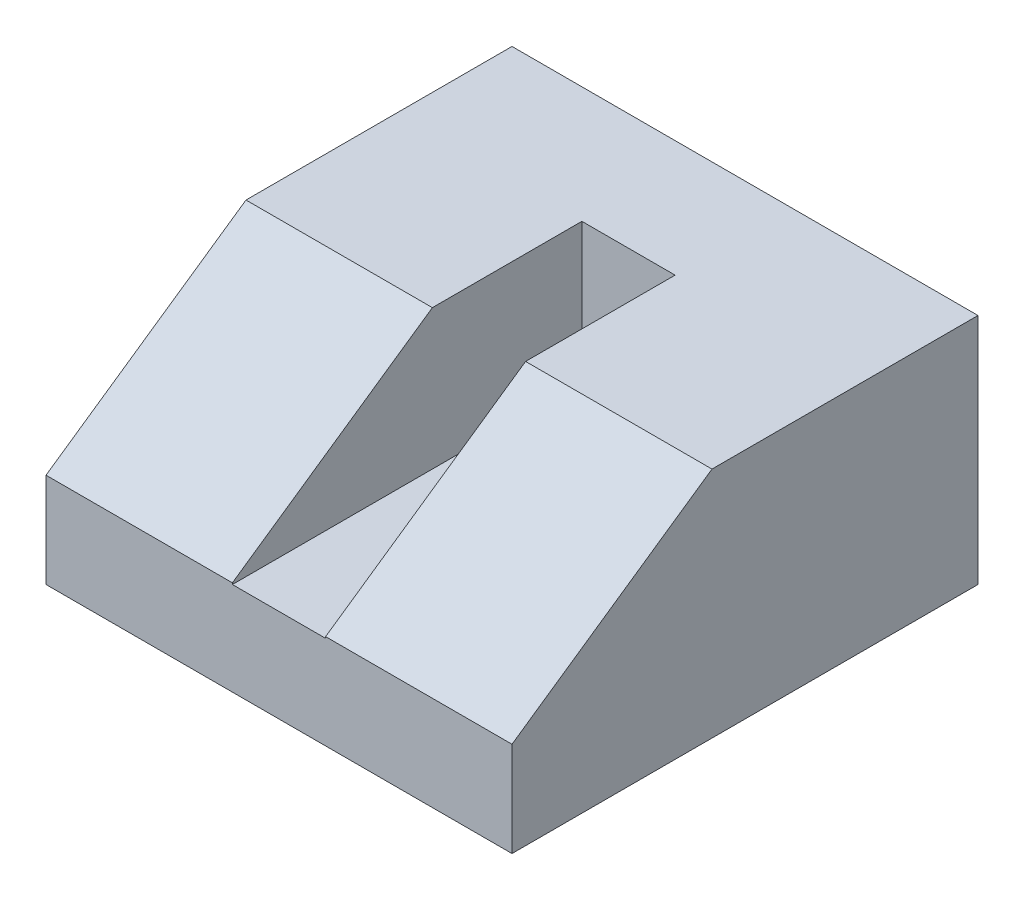
ISO-10303-21;
HEADER;
FILE_DESCRIPTION(('STEP AP214'),'2;1');
FILE_NAME('part.step','',(''),(''),'','','');
FILE_SCHEMA(('AUTOMOTIVE_DESIGN { 1 0 10303 214 1 1 1 1 }'));
ENDSEC;
DATA;
#1=APPLICATION_CONTEXT('core data for automotive mechanical design processes');
#2=APPLICATION_PROTOCOL_DEFINITION('international standard','automotive_design',2000,#1);
#3=PRODUCT_CONTEXT('',#1,'mechanical');
#4=PRODUCT('Part','Part','',(#3));
#5=PRODUCT_RELATED_PRODUCT_CATEGORY('part','',(#4));
#6=PRODUCT_DEFINITION_FORMATION('','',#4);
#7=PRODUCT_DEFINITION_CONTEXT('part definition',#1,'design');
#8=PRODUCT_DEFINITION('design','',#6,#7);
#9=PRODUCT_DEFINITION_SHAPE('','',#8);
#10=(LENGTH_UNIT() NAMED_UNIT(*) SI_UNIT(.MILLI.,.METRE.));
#11=(NAMED_UNIT(*) PLANE_ANGLE_UNIT() SI_UNIT($,.RADIAN.));
#12=(NAMED_UNIT(*) SI_UNIT($,.STERADIAN.) SOLID_ANGLE_UNIT());
#13=UNCERTAINTY_MEASURE_WITH_UNIT(LENGTH_MEASURE(1.E-05),#10,'distance_accuracy_value','');
#14=(GEOMETRIC_REPRESENTATION_CONTEXT(3) GLOBAL_UNCERTAINTY_ASSIGNED_CONTEXT((#13)) GLOBAL_UNIT_ASSIGNED_CONTEXT((#10,
#11,#12)) REPRESENTATION_CONTEXT('',''));
#15=CARTESIAN_POINT('',(0.,0.,0.));
#16=DIRECTION('',(0.,0.,1.));
#17=DIRECTION('',(1.,0.,0.));
#18=AXIS2_PLACEMENT_3D('',#15,#16,#17);
#19=CARTESIAN_POINT('',(50.,30.3188474115432,50.));
#20=DIRECTION('',(0.,-0.822451200777575,-0.568835672527247));
#21=DIRECTION('',(0.,0.568835672527247,-0.822451200777575));
#22=AXIS2_PLACEMENT_3D('',#19,#20,#21);
#23=PLANE('',#22);
#24=DIRECTION('',(-1.,0.,0.));
#25=VECTOR('',#24,1.);
#26=CARTESIAN_POINT('',(50.,30.3188474115432,50.));
#27=LINE('',#26,#25);
#28=CARTESIAN_POINT('',(-10.,30.3188474115432,50.));
#29=VERTEX_POINT('',#28);
#30=CARTESIAN_POINT('',(-50.,30.3188474115432,50.));
#31=VERTEX_POINT('',#30);
#32=EDGE_CURVE('E160',#29,#31,#27,.T.);
#33=ORIENTED_EDGE('',*,*,#32,.F.);
#34=DIRECTION('',(0.,0.568835672527247,-0.822451200777575));
#35=VECTOR('',#34,1.);
#36=CARTESIAN_POINT('',(-10.,30.3188474115432,50.));
#37=LINE('',#36,#35);
#38=CARTESIAN_POINT('',(-10.,60.,7.08549803428611));
#39=VERTEX_POINT('',#38);
#40=EDGE_CURVE('E11',#29,#39,#37,.T.);
#41=ORIENTED_EDGE('',*,*,#40,.T.);
#42=DIRECTION('',(-1.,0.,0.));
#43=VECTOR('',#42,1.);
#44=CARTESIAN_POINT('',(50.,60.,7.0854980342861));
#45=LINE('',#44,#43);
#46=CARTESIAN_POINT('',(-50.,60.,7.0854980342861));
#47=VERTEX_POINT('',#46);
#48=EDGE_CURVE('E154',#39,#47,#45,.T.);
#49=ORIENTED_EDGE('',*,*,#48,.T.);
#50=DIRECTION('',(0.,-0.568835672527247,0.822451200777575));
#51=VECTOR('',#50,1.);
#52=CARTESIAN_POINT('',(-50.,30.3188474115432,50.));
#53=LINE('',#52,#51);
#54=EDGE_CURVE('E148',#47,#31,#53,.T.);
#55=ORIENTED_EDGE('',*,*,#54,.T.);
#56=EDGE_LOOP('',(#33,#41,#49,#55));
#57=FACE_BOUND('',#56,.T.);
#58=ADVANCED_FACE('F37',(#57),#23,.F.);
#59=CARTESIAN_POINT('',(0.,10.,0.));
#60=DIRECTION('',(0.,-1.,0.));
#61=DIRECTION('',(0.,0.,-1.));
#62=AXIS2_PLACEMENT_3D('',#59,#60,#61);
#63=CYLINDRICAL_SURFACE('',#62,25.);
#64=CARTESIAN_POINT('',(0.,10.,0.));
#65=DIRECTION('',(0.,1.,0.));
#66=DIRECTION('',(0.,0.,1.));
#67=AXIS2_PLACEMENT_3D('',#64,#65,#66);
#68=CIRCLE('',#67,25.);
#69=CARTESIAN_POINT('',(0.,10.,25.));
#70=VERTEX_POINT('',#69);
#71=EDGE_CURVE('E190',#70,#70,#68,.T.);
#72=ORIENTED_EDGE('',*,*,#71,.F.);
#73=EDGE_LOOP('',(#72));
#74=FACE_BOUND('',#73,.T.);
#75=CARTESIAN_POINT('',(0.,0.,0.));
#76=DIRECTION('',(0.,1.,0.));
#77=DIRECTION('',(0.,0.,1.));
#78=AXIS2_PLACEMENT_3D('',#75,#76,#77);
#79=CIRCLE('',#78,25.);
#80=CARTESIAN_POINT('',(0.,0.,25.));
#81=VERTEX_POINT('',#80);
#82=EDGE_CURVE('E189',#81,#81,#79,.T.);
#83=ORIENTED_EDGE('',*,*,#82,.T.);
#84=EDGE_LOOP('',(#83));
#85=FACE_BOUND('',#84,.T.);
#86=ADVANCED_FACE('F39',(#74,#85),#63,.T.);
#87=CARTESIAN_POINT('',(0.,0.,0.));
#88=DIRECTION('',(0.,1.,0.));
#89=DIRECTION('',(0.,0.,1.));
#90=AXIS2_PLACEMENT_3D('',#87,#88,#89);
#91=PLANE('',#90);
#92=ORIENTED_EDGE('',*,*,#82,.F.);
#93=EDGE_LOOP('',(#92));
#94=FACE_BOUND('',#93,.T.);
#95=ADVANCED_FACE('F239',(#94),#91,.F.);
#96=CARTESIAN_POINT('',(-50.,60.,50.));
#97=DIRECTION('',(1.,0.,0.));
#98=DIRECTION('',(0.,0.,-1.));
#99=AXIS2_PLACEMENT_3D('',#96,#97,#98);
#100=PLANE('',#99);
#101=DIRECTION('',(0.,-1.,0.));
#102=VECTOR('',#101,1.);
#103=CARTESIAN_POINT('',(-50.,60.,50.));
#104=LINE('',#103,#102);
#105=CARTESIAN_POINT('',(-50.,10.,50.));
#106=VERTEX_POINT('',#105);
#107=EDGE_CURVE('E187',#31,#106,#104,.T.);
#108=ORIENTED_EDGE('',*,*,#107,.F.);
#109=ORIENTED_EDGE('',*,*,#54,.F.);
#110=DIRECTION('',(0.,0.,1.));
#111=VECTOR('',#110,1.);
#112=CARTESIAN_POINT('',(-50.,60.,50.));
#113=LINE('',#112,#111);
#114=CARTESIAN_POINT('',(-50.,60.,-50.));
#115=VERTEX_POINT('',#114);
#116=EDGE_CURVE('E163',#115,#47,#113,.T.);
#117=ORIENTED_EDGE('',*,*,#116,.F.);
#118=DIRECTION('',(0.,-1.,0.));
#119=VECTOR('',#118,1.);
#120=CARTESIAN_POINT('',(-50.,60.,-50.));
#121=LINE('',#120,#119);
#122=CARTESIAN_POINT('',(-50.,10.,-50.));
#123=VERTEX_POINT('',#122);
#124=EDGE_CURVE('E171',#115,#123,#121,.T.);
#125=ORIENTED_EDGE('',*,*,#124,.T.);
#126=DIRECTION('',(0.,0.,1.));
#127=VECTOR('',#126,1.);
#128=CARTESIAN_POINT('',(-50.,10.,50.));
#129=LINE('',#128,#127);
#130=EDGE_CURVE('E159',#123,#106,#129,.T.);
#131=ORIENTED_EDGE('',*,*,#130,.T.);
#132=EDGE_LOOP('',(#108,#109,#117,#125,#131));
#133=FACE_BOUND('',#132,.T.);
#134=ADVANCED_FACE('F218',(#133),#100,.F.);
#135=CARTESIAN_POINT('',(50.,60.,50.));
#136=DIRECTION('',(0.,0.,-1.));
#137=DIRECTION('',(-1.,0.,0.));
#138=AXIS2_PLACEMENT_3D('',#135,#136,#137);
#139=PLANE('',#138);
#140=DIRECTION('',(1.,0.,0.));
#141=VECTOR('',#140,1.);
#142=CARTESIAN_POINT('',(-10.,30.,50.));
#143=LINE('',#142,#141);
#144=CARTESIAN_POINT('',(-10.,30.,50.));
#145=VERTEX_POINT('',#144);
#146=CARTESIAN_POINT('',(10.,30.,50.));
#147=VERTEX_POINT('',#146);
#148=EDGE_CURVE('E129',#145,#147,#143,.T.);
#149=ORIENTED_EDGE('',*,*,#148,.F.);
#150=DIRECTION('',(0.,1.,0.));
#151=VECTOR('',#150,1.);
#152=CARTESIAN_POINT('',(-10.,30.,50.));
#153=LINE('',#152,#151);
#154=EDGE_CURVE('E115',#145,#29,#153,.T.);
#155=ORIENTED_EDGE('',*,*,#154,.T.);
#156=ORIENTED_EDGE('',*,*,#32,.T.);
#157=ORIENTED_EDGE('',*,*,#107,.T.);
#158=DIRECTION('',(1.,0.,0.));
#159=VECTOR('',#158,1.);
#160=CARTESIAN_POINT('',(50.,10.,50.));
#161=LINE('',#160,#159);
#162=CARTESIAN_POINT('',(50.,10.,50.));
#163=VERTEX_POINT('',#162);
#164=EDGE_CURVE('E174',#106,#163,#161,.T.);
#165=ORIENTED_EDGE('',*,*,#164,.T.);
#166=DIRECTION('',(0.,-1.,0.));
#167=VECTOR('',#166,1.);
#168=CARTESIAN_POINT('',(50.,60.,50.));
#169=LINE('',#168,#167);
#170=CARTESIAN_POINT('',(50.,30.3188474115432,50.));
#171=VERTEX_POINT('',#170);
#172=EDGE_CURVE('E185',#171,#163,#169,.T.);
#173=ORIENTED_EDGE('',*,*,#172,.F.);
#174=CARTESIAN_POINT('',(10.,30.3188474115432,50.));
#175=VERTEX_POINT('',#174);
#176=EDGE_CURVE('E157',#171,#175,#27,.T.);
#177=ORIENTED_EDGE('',*,*,#176,.T.);
#178=DIRECTION('',(0.,1.,0.));
#179=VECTOR('',#178,1.);
#180=CARTESIAN_POINT('',(10.,30.,50.));
#181=LINE('',#180,#179);
#182=EDGE_CURVE('E52',#147,#175,#181,.T.);
#183=ORIENTED_EDGE('',*,*,#182,.F.);
#184=EDGE_LOOP('',(#149,#155,#156,#157,#165,#173,#177,#183));
#185=FACE_BOUND('',#184,.T.);
#186=ADVANCED_FACE('F133',(#185),#139,.F.);
#187=CARTESIAN_POINT('',(50.,60.,50.));
#188=DIRECTION('',(-1.,0.,0.));
#189=DIRECTION('',(0.,0.,1.));
#190=AXIS2_PLACEMENT_3D('',#187,#188,#189);
#191=PLANE('',#190);
#192=DIRECTION('',(0.,0.,-1.));
#193=VECTOR('',#192,1.);
#194=CARTESIAN_POINT('',(50.,60.,50.));
#195=LINE('',#194,#193);
#196=CARTESIAN_POINT('',(50.,60.,7.0854980342861));
#197=VERTEX_POINT('',#196);
#198=CARTESIAN_POINT('',(50.,60.,-50.));
#199=VERTEX_POINT('',#198);
#200=EDGE_CURVE('E166',#197,#199,#195,.T.);
#201=ORIENTED_EDGE('',*,*,#200,.F.);
#202=DIRECTION('',(0.,-0.568835672527247,0.822451200777575));
#203=VECTOR('',#202,1.);
#204=CARTESIAN_POINT('',(50.,30.3188474115432,50.));
#205=LINE('',#204,#203);
#206=EDGE_CURVE('E60',#197,#171,#205,.T.);
#207=ORIENTED_EDGE('',*,*,#206,.T.);
#208=ORIENTED_EDGE('',*,*,#172,.T.);
#209=DIRECTION('',(0.,0.,-1.));
#210=VECTOR('',#209,1.);
#211=CARTESIAN_POINT('',(50.,10.,50.));
#212=LINE('',#211,#210);
#213=CARTESIAN_POINT('',(50.,10.,-50.));
#214=VERTEX_POINT('',#213);
#215=EDGE_CURVE('E177',#163,#214,#212,.T.);
#216=ORIENTED_EDGE('',*,*,#215,.T.);
#217=DIRECTION('',(0.,-1.,0.));
#218=VECTOR('',#217,1.);
#219=CARTESIAN_POINT('',(50.,60.,-50.));
#220=LINE('',#219,#218);
#221=EDGE_CURVE('E182',#199,#214,#220,.T.);
#222=ORIENTED_EDGE('',*,*,#221,.F.);
#223=EDGE_LOOP('',(#201,#207,#208,#216,#222));
#224=FACE_BOUND('',#223,.T.);
#225=ADVANCED_FACE('F201',(#224),#191,.F.);
#226=CARTESIAN_POINT('',(50.,60.,-50.));
#227=DIRECTION('',(0.,0.,1.));
#228=DIRECTION('',(1.,0.,0.));
#229=AXIS2_PLACEMENT_3D('',#226,#227,#228);
#230=PLANE('',#229);
#231=DIRECTION('',(-1.,0.,0.));
#232=VECTOR('',#231,1.);
#233=CARTESIAN_POINT('',(50.,10.,-50.));
#234=LINE('',#233,#232);
#235=EDGE_CURVE('E167',#214,#123,#234,.T.);
#236=ORIENTED_EDGE('',*,*,#235,.T.);
#237=ORIENTED_EDGE('',*,*,#124,.F.);
#238=DIRECTION('',(-1.,0.,0.));
#239=VECTOR('',#238,1.);
#240=CARTESIAN_POINT('',(50.,60.,-50.));
#241=LINE('',#240,#239);
#242=EDGE_CURVE('E169',#199,#115,#241,.T.);
#243=ORIENTED_EDGE('',*,*,#242,.F.);
#244=ORIENTED_EDGE('',*,*,#221,.T.);
#245=EDGE_LOOP('',(#236,#237,#243,#244));
#246=FACE_BOUND('',#245,.T.);
#247=ADVANCED_FACE('F224',(#246),#230,.F.);
#248=CARTESIAN_POINT('',(0.,60.,0.));
#249=DIRECTION('',(0.,1.,0.));
#250=DIRECTION('',(0.,0.,1.));
#251=AXIS2_PLACEMENT_3D('',#248,#249,#250);
#252=PLANE('',#251);
#253=DIRECTION('',(0.,0.,1.));
#254=VECTOR('',#253,1.);
#255=CARTESIAN_POINT('',(-10.,60.,50.));
#256=LINE('',#255,#254);
#257=CARTESIAN_POINT('',(-10.,60.,-25.0000000000001));
#258=VERTEX_POINT('',#257);
#259=EDGE_CURVE('E140',#258,#39,#256,.T.);
#260=ORIENTED_EDGE('',*,*,#259,.F.);
#261=DIRECTION('',(-1.,0.,0.));
#262=VECTOR('',#261,1.);
#263=CARTESIAN_POINT('',(-10.,60.,-25.0000000000001));
#264=LINE('',#263,#262);
#265=CARTESIAN_POINT('',(10.,60.,-25.0000000000001));
#266=VERTEX_POINT('',#265);
#267=EDGE_CURVE('E131',#266,#258,#264,.T.);
#268=ORIENTED_EDGE('',*,*,#267,.F.);
#269=DIRECTION('',(0.,0.,-1.));
#270=VECTOR('',#269,1.);
#271=CARTESIAN_POINT('',(10.,60.,50.));
#272=LINE('',#271,#270);
#273=CARTESIAN_POINT('',(10.,60.,7.08549803428611));
#274=VERTEX_POINT('',#273);
#275=EDGE_CURVE('E142',#274,#266,#272,.T.);
#276=ORIENTED_EDGE('',*,*,#275,.F.);
#277=EDGE_CURVE('E161',#197,#274,#45,.T.);
#278=ORIENTED_EDGE('',*,*,#277,.F.);
#279=ORIENTED_EDGE('',*,*,#200,.T.);
#280=ORIENTED_EDGE('',*,*,#242,.T.);
#281=ORIENTED_EDGE('',*,*,#116,.T.);
#282=ORIENTED_EDGE('',*,*,#48,.F.);
#283=EDGE_LOOP('',(#260,#268,#276,#278,#279,#280,#281,#282));
#284=FACE_BOUND('',#283,.T.);
#285=ADVANCED_FACE('F206',(#284),#252,.T.);
#286=CARTESIAN_POINT('',(0.,10.,0.));
#287=DIRECTION('',(0.,1.,0.));
#288=DIRECTION('',(0.,0.,1.));
#289=AXIS2_PLACEMENT_3D('',#286,#287,#288);
#290=PLANE('',#289);
#291=ORIENTED_EDGE('',*,*,#71,.T.);
#292=EDGE_LOOP('',(#291));
#293=FACE_BOUND('',#292,.T.);
#294=ORIENTED_EDGE('',*,*,#130,.F.);
#295=ORIENTED_EDGE('',*,*,#235,.F.);
#296=ORIENTED_EDGE('',*,*,#215,.F.);
#297=ORIENTED_EDGE('',*,*,#164,.F.);
#298=EDGE_LOOP('',(#294,#295,#296,#297));
#299=FACE_BOUND('',#298,.T.);
#300=ADVANCED_FACE('F221',(#293,#299),#290,.F.);
#301=ORIENTED_EDGE('',*,*,#277,.T.);
#302=DIRECTION('',(0.,-0.568835672527247,0.822451200777575));
#303=VECTOR('',#302,1.);
#304=CARTESIAN_POINT('',(10.,30.3188474115432,50.));
#305=LINE('',#304,#303);
#306=EDGE_CURVE('E45',#274,#175,#305,.T.);
#307=ORIENTED_EDGE('',*,*,#306,.T.);
#308=ORIENTED_EDGE('',*,*,#176,.F.);
#309=ORIENTED_EDGE('',*,*,#206,.F.);
#310=EDGE_LOOP('',(#301,#307,#308,#309));
#311=FACE_BOUND('',#310,.T.);
#312=ADVANCED_FACE('F194',(#311),#23,.F.);
#313=CARTESIAN_POINT('',(-10.,30.,50.));
#314=DIRECTION('',(-1.,0.,0.));
#315=DIRECTION('',(0.,0.,1.));
#316=AXIS2_PLACEMENT_3D('',#313,#314,#315);
#317=PLANE('',#316);
#318=ORIENTED_EDGE('',*,*,#154,.F.);
#319=DIRECTION('',(0.,0.,1.));
#320=VECTOR('',#319,1.);
#321=CARTESIAN_POINT('',(-10.,30.,50.));
#322=LINE('',#321,#320);
#323=CARTESIAN_POINT('',(-10.,30.,-25.0000000000001));
#324=VERTEX_POINT('',#323);
#325=EDGE_CURVE('E118',#324,#145,#322,.T.);
#326=ORIENTED_EDGE('',*,*,#325,.F.);
#327=DIRECTION('',(0.,1.,0.));
#328=VECTOR('',#327,1.);
#329=CARTESIAN_POINT('',(-10.,30.,-25.0000000000001));
#330=LINE('',#329,#328);
#331=EDGE_CURVE('E146',#324,#258,#330,.T.);
#332=ORIENTED_EDGE('',*,*,#331,.T.);
#333=ORIENTED_EDGE('',*,*,#259,.T.);
#334=ORIENTED_EDGE('',*,*,#40,.F.);
#335=EDGE_LOOP('',(#318,#326,#332,#333,#334));
#336=FACE_BOUND('',#335,.T.);
#337=ADVANCED_FACE('F117',(#336),#317,.F.);
#338=CARTESIAN_POINT('',(10.,30.,50.));
#339=DIRECTION('',(1.,0.,0.));
#340=DIRECTION('',(0.,0.,-1.));
#341=AXIS2_PLACEMENT_3D('',#338,#339,#340);
#342=PLANE('',#341);
#343=ORIENTED_EDGE('',*,*,#275,.T.);
#344=DIRECTION('',(0.,1.,0.));
#345=VECTOR('',#344,1.);
#346=CARTESIAN_POINT('',(10.,30.,-25.0000000000001));
#347=LINE('',#346,#345);
#348=CARTESIAN_POINT('',(10.,30.,-25.0000000000001));
#349=VERTEX_POINT('',#348);
#350=EDGE_CURVE('E149',#349,#266,#347,.T.);
#351=ORIENTED_EDGE('',*,*,#350,.F.);
#352=DIRECTION('',(0.,0.,-1.));
#353=VECTOR('',#352,1.);
#354=CARTESIAN_POINT('',(10.,30.,50.));
#355=LINE('',#354,#353);
#356=EDGE_CURVE('E135',#147,#349,#355,.T.);
#357=ORIENTED_EDGE('',*,*,#356,.F.);
#358=ORIENTED_EDGE('',*,*,#182,.T.);
#359=ORIENTED_EDGE('',*,*,#306,.F.);
#360=EDGE_LOOP('',(#343,#351,#357,#358,#359));
#361=FACE_BOUND('',#360,.T.);
#362=ADVANCED_FACE('F209',(#361),#342,.F.);
#363=CARTESIAN_POINT('',(-10.,30.,-25.0000000000001));
#364=DIRECTION('',(0.,0.,-1.));
#365=DIRECTION('',(-1.,0.,0.));
#366=AXIS2_PLACEMENT_3D('',#363,#364,#365);
#367=PLANE('',#366);
#368=ORIENTED_EDGE('',*,*,#267,.T.);
#369=ORIENTED_EDGE('',*,*,#331,.F.);
#370=DIRECTION('',(-1.,0.,0.));
#371=VECTOR('',#370,1.);
#372=CARTESIAN_POINT('',(-10.,30.,-25.0000000000001));
#373=LINE('',#372,#371);
#374=EDGE_CURVE('E123',#349,#324,#373,.T.);
#375=ORIENTED_EDGE('',*,*,#374,.F.);
#376=ORIENTED_EDGE('',*,*,#350,.T.);
#377=EDGE_LOOP('',(#368,#369,#375,#376));
#378=FACE_BOUND('',#377,.T.);
#379=ADVANCED_FACE('F211',(#378),#367,.F.);
#380=CARTESIAN_POINT('',(0.,30.,0.));
#381=DIRECTION('',(0.,-1.,0.));
#382=DIRECTION('',(0.,0.,-1.));
#383=AXIS2_PLACEMENT_3D('',#380,#381,#382);
#384=PLANE('',#383);
#385=ORIENTED_EDGE('',*,*,#325,.T.);
#386=ORIENTED_EDGE('',*,*,#148,.T.);
#387=ORIENTED_EDGE('',*,*,#356,.T.);
#388=ORIENTED_EDGE('',*,*,#374,.T.);
#389=EDGE_LOOP('',(#385,#386,#387,#388));
#390=FACE_BOUND('',#389,.T.);
#391=ADVANCED_FACE('F127',(#390),#384,.F.);
#392=CLOSED_SHELL('',(#58,#86,#95,#134,#186,#225,#247,#285,#300,#312,#337,#362,#379,#391));
#393=MANIFOLD_SOLID_BREP('B2',#392);
#394=ADVANCED_BREP_SHAPE_REPRESENTATION('',(#18,#393),#14);
#395=SHAPE_DEFINITION_REPRESENTATION(#9,#394);
ENDSEC;
END-ISO-10303-21;
